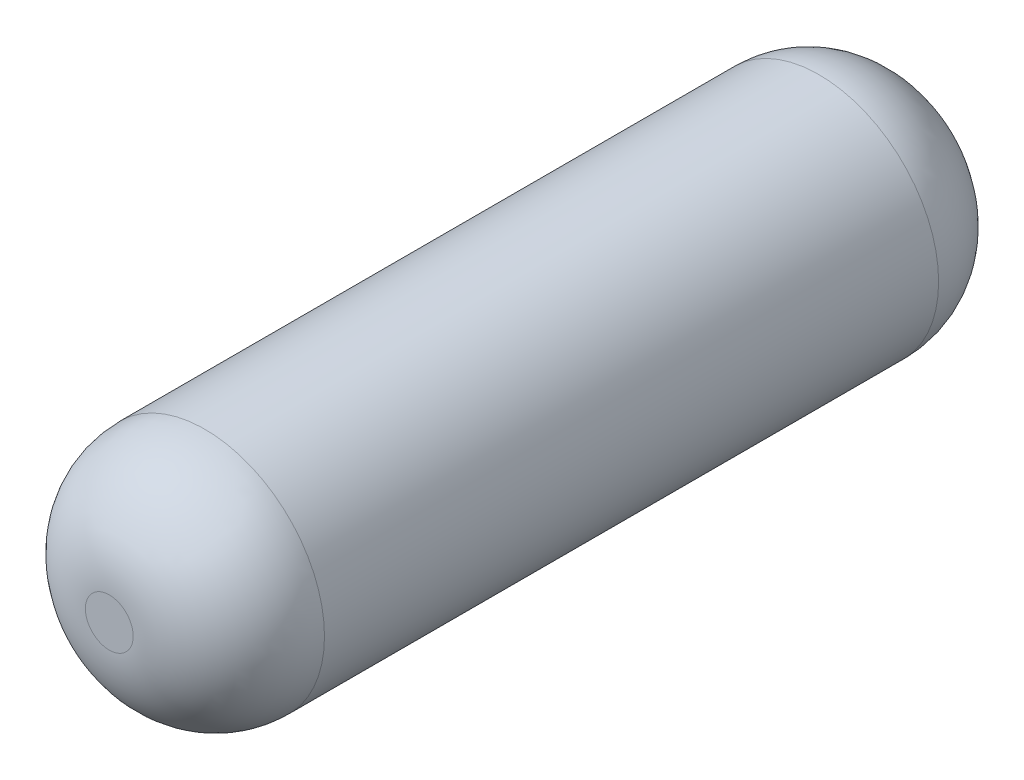
ISO-10303-21;
HEADER;
FILE_DESCRIPTION(('STEP AP214'),'2;1');
FILE_NAME('part.step','',(''),(''),'','','');
FILE_SCHEMA(('AUTOMOTIVE_DESIGN { 1 0 10303 214 1 1 1 1 }'));
ENDSEC;
DATA;
#1=APPLICATION_CONTEXT('core data for automotive mechanical design processes');
#2=APPLICATION_PROTOCOL_DEFINITION('international standard','automotive_design',2000,#1);
#3=PRODUCT_CONTEXT('',#1,'mechanical');
#4=PRODUCT('Part','Part','',(#3));
#5=PRODUCT_RELATED_PRODUCT_CATEGORY('part','',(#4));
#6=PRODUCT_DEFINITION_FORMATION('','',#4);
#7=PRODUCT_DEFINITION_CONTEXT('part definition',#1,'design');
#8=PRODUCT_DEFINITION('design','',#6,#7);
#9=PRODUCT_DEFINITION_SHAPE('','',#8);
#10=(LENGTH_UNIT() NAMED_UNIT(*) SI_UNIT(.MILLI.,.METRE.));
#11=(NAMED_UNIT(*) PLANE_ANGLE_UNIT() SI_UNIT($,.RADIAN.));
#12=(NAMED_UNIT(*) SI_UNIT($,.STERADIAN.) SOLID_ANGLE_UNIT());
#13=UNCERTAINTY_MEASURE_WITH_UNIT(LENGTH_MEASURE(1.E-05),#10,'distance_accuracy_value','');
#14=(GEOMETRIC_REPRESENTATION_CONTEXT(3) GLOBAL_UNCERTAINTY_ASSIGNED_CONTEXT((#13)) GLOBAL_UNIT_ASSIGNED_CONTEXT((#10,
#11,#12)) REPRESENTATION_CONTEXT('',''));
#15=CARTESIAN_POINT('',(0.,0.,0.));
#16=DIRECTION('',(0.,0.,1.));
#17=DIRECTION('',(1.,0.,0.));
#18=AXIS2_PLACEMENT_3D('',#15,#16,#17);
#19=CARTESIAN_POINT('',(0.,0.,406.4));
#20=DIRECTION('',(0.,0.,-1.));
#21=DIRECTION('',(-1.,0.,0.));
#22=AXIS2_PLACEMENT_3D('',#19,#20,#21);
#23=CYLINDRICAL_SURFACE('',#22,60.325);
#24=CARTESIAN_POINT('',(0.,0.,48.26));
#25=DIRECTION('',(0.,0.,1.));
#26=DIRECTION('',(1.,0.,0.));
#27=AXIS2_PLACEMENT_3D('',#24,#25,#26);
#28=CIRCLE('',#27,60.325);
#29=CARTESIAN_POINT('',(60.325,0.,48.26));
#30=VERTEX_POINT('',#29);
#31=EDGE_CURVE('E50',#30,#30,#28,.T.);
#32=ORIENTED_EDGE('',*,*,#31,.T.);
#33=EDGE_LOOP('',(#32));
#34=FACE_BOUND('',#33,.T.);
#35=CARTESIAN_POINT('',(0.,0.,358.14));
#36=DIRECTION('',(0.,0.,1.));
#37=DIRECTION('',(1.,0.,0.));
#38=AXIS2_PLACEMENT_3D('',#35,#36,#37);
#39=CIRCLE('',#38,60.325);
#40=CARTESIAN_POINT('',(60.325,0.,358.14));
#41=VERTEX_POINT('',#40);
#42=EDGE_CURVE('E54',#41,#41,#39,.F.);
#43=ORIENTED_EDGE('',*,*,#42,.T.);
#44=EDGE_LOOP('',(#43));
#45=FACE_BOUND('',#44,.T.);
#46=ADVANCED_FACE('F39',(#34,#45),#23,.T.);
#47=CARTESIAN_POINT('',(0.,0.,406.4));
#48=DIRECTION('',(0.,0.,1.));
#49=DIRECTION('',(1.,0.,0.));
#50=AXIS2_PLACEMENT_3D('',#47,#48,#49);
#51=PLANE('',#50);
#52=CARTESIAN_POINT('',(0.,0.,406.4));
#53=DIRECTION('',(0.,0.,1.));
#54=DIRECTION('',(1.,0.,0.));
#55=AXIS2_PLACEMENT_3D('',#52,#53,#54);
#56=CIRCLE('',#55,12.065);
#57=CARTESIAN_POINT('',(12.065,0.,406.4));
#58=VERTEX_POINT('',#57);
#59=EDGE_CURVE('E10',#58,#58,#56,.T.);
#60=ORIENTED_EDGE('',*,*,#59,.T.);
#61=EDGE_LOOP('',(#60));
#62=FACE_BOUND('',#61,.T.);
#63=ADVANCED_FACE('F70',(#62),#51,.T.);
#64=CARTESIAN_POINT('',(0.,0.,0.));
#65=DIRECTION('',(0.,0.,1.));
#66=DIRECTION('',(1.,0.,0.));
#67=AXIS2_PLACEMENT_3D('',#64,#65,#66);
#68=PLANE('',#67);
#69=CARTESIAN_POINT('',(0.,0.,0.));
#70=DIRECTION('',(0.,0.,1.));
#71=DIRECTION('',(1.,0.,0.));
#72=AXIS2_PLACEMENT_3D('',#69,#70,#71);
#73=CIRCLE('',#72,12.065);
#74=CARTESIAN_POINT('',(12.065,0.,0.));
#75=VERTEX_POINT('',#74);
#76=EDGE_CURVE('E46',#75,#75,#73,.F.);
#77=ORIENTED_EDGE('',*,*,#76,.T.);
#78=EDGE_LOOP('',(#77));
#79=FACE_BOUND('',#78,.T.);
#80=ADVANCED_FACE('F67',(#79),#68,.F.);
#81=CARTESIAN_POINT('',(0.,0.,48.26));
#82=DIRECTION('',(0.,0.,1.));
#83=DIRECTION('',(1.,0.,0.));
#84=AXIS2_PLACEMENT_3D('',#81,#82,#83);
#85=DEGENERATE_TOROIDAL_SURFACE('',#84,12.065,48.26,.T.);
#86=ORIENTED_EDGE('',*,*,#76,.F.);
#87=EDGE_LOOP('',(#86));
#88=FACE_BOUND('',#87,.T.);
#89=ORIENTED_EDGE('',*,*,#31,.F.);
#90=EDGE_LOOP('',(#89));
#91=FACE_BOUND('',#90,.T.);
#92=ADVANCED_FACE('F63',(#88,#91),#85,.T.);
#93=CARTESIAN_POINT('',(0.,0.,358.14));
#94=DIRECTION('',(0.,0.,1.));
#95=DIRECTION('',(1.,0.,0.));
#96=AXIS2_PLACEMENT_3D('',#93,#94,#95);
#97=DEGENERATE_TOROIDAL_SURFACE('',#96,12.065,48.26,.T.);
#98=ORIENTED_EDGE('',*,*,#42,.F.);
#99=EDGE_LOOP('',(#98));
#100=FACE_BOUND('',#99,.T.);
#101=ORIENTED_EDGE('',*,*,#59,.F.);
#102=EDGE_LOOP('',(#101));
#103=FACE_BOUND('',#102,.T.);
#104=ADVANCED_FACE('F41',(#100,#103),#97,.T.);
#105=CLOSED_SHELL('',(#46,#63,#80,#92,#104));
#106=MANIFOLD_SOLID_BREP('B2',#105);
#107=ADVANCED_BREP_SHAPE_REPRESENTATION('',(#18,#106),#14);
#108=SHAPE_DEFINITION_REPRESENTATION(#9,#107);
ENDSEC;
END-ISO-10303-21;
